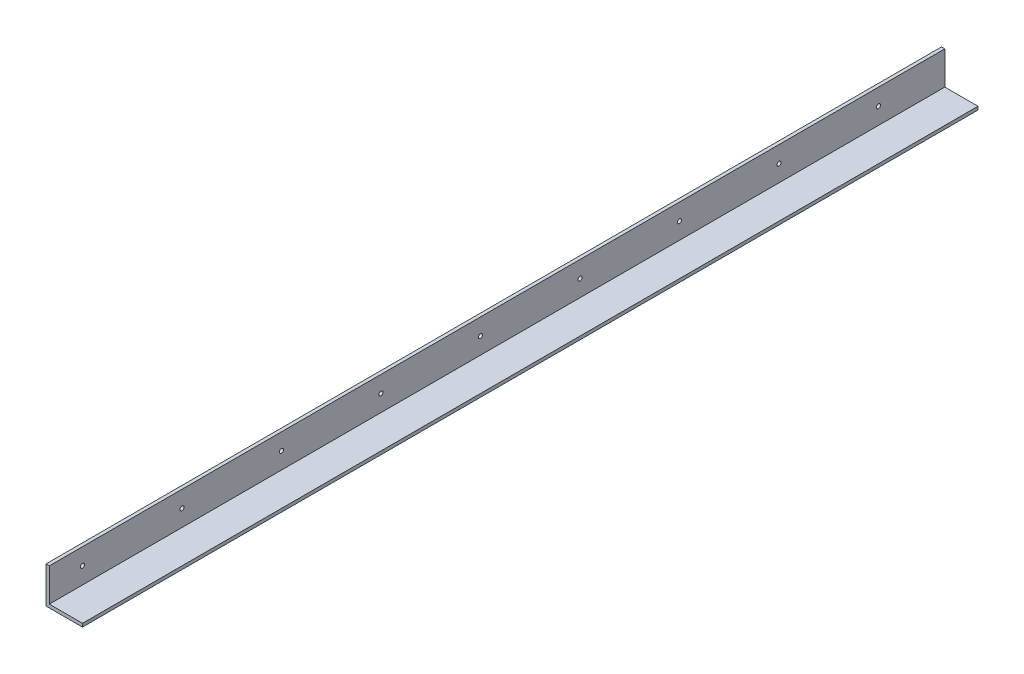
ISO-10303-21;
HEADER;
FILE_DESCRIPTION(('STEP AP214'),'2;1');
FILE_NAME('part.step','',(''),(''),'','','');
FILE_SCHEMA(('AUTOMOTIVE_DESIGN { 1 0 10303 214 1 1 1 1 }'));
ENDSEC;
DATA;
#1=APPLICATION_CONTEXT('core data for automotive mechanical design processes');
#2=APPLICATION_PROTOCOL_DEFINITION('international standard','automotive_design',2000,#1);
#3=PRODUCT_CONTEXT('',#1,'mechanical');
#4=PRODUCT('Part','Part','',(#3));
#5=PRODUCT_RELATED_PRODUCT_CATEGORY('part','',(#4));
#6=PRODUCT_DEFINITION_FORMATION('','',#4);
#7=PRODUCT_DEFINITION_CONTEXT('part definition',#1,'design');
#8=PRODUCT_DEFINITION('design','',#6,#7);
#9=PRODUCT_DEFINITION_SHAPE('','',#8);
#10=(LENGTH_UNIT() NAMED_UNIT(*) SI_UNIT(.MILLI.,.METRE.));
#11=(NAMED_UNIT(*) PLANE_ANGLE_UNIT() SI_UNIT($,.RADIAN.));
#12=(NAMED_UNIT(*) SI_UNIT($,.STERADIAN.) SOLID_ANGLE_UNIT());
#13=UNCERTAINTY_MEASURE_WITH_UNIT(LENGTH_MEASURE(1.E-05),#10,'distance_accuracy_value','');
#14=(GEOMETRIC_REPRESENTATION_CONTEXT(3) GLOBAL_UNCERTAINTY_ASSIGNED_CONTEXT((#13)) GLOBAL_UNIT_ASSIGNED_CONTEXT((#10,
#11,#12)) REPRESENTATION_CONTEXT('',''));
#15=CARTESIAN_POINT('',(0.,0.,0.));
#16=DIRECTION('',(0.,0.,1.));
#17=DIRECTION('',(1.,0.,0.));
#18=AXIS2_PLACEMENT_3D('',#15,#16,#17);
#19=CARTESIAN_POINT('',(0.,0.,1030.));
#20=DIRECTION('',(-1.,0.,0.));
#21=DIRECTION('',(0.,-1.,0.));
#22=AXIS2_PLACEMENT_3D('',#19,#20,#21);
#23=PLANE('',#22);
#24=CARTESIAN_POINT('',(0.,24.,990.));
#25=DIRECTION('',(1.,0.,0.));
#26=DIRECTION('',(0.,0.,-1.));
#27=AXIS2_PLACEMENT_3D('',#24,#25,#26);
#28=CIRCLE('',#27,2.49999999999991);
#29=CARTESIAN_POINT('',(0.,24.,987.5));
#30=VERTEX_POINT('',#29);
#31=EDGE_CURVE('E135',#30,#30,#28,.T.);
#32=ORIENTED_EDGE('',*,*,#31,.T.);
#33=EDGE_LOOP('',(#32));
#34=FACE_BOUND('',#33,.T.);
#35=CARTESIAN_POINT('',(0.,24.,870.));
#36=DIRECTION('',(1.,0.,0.));
#37=DIRECTION('',(0.,0.,-1.));
#38=AXIS2_PLACEMENT_3D('',#35,#36,#37);
#39=CIRCLE('',#38,2.49999999999991);
#40=CARTESIAN_POINT('',(0.,24.,867.5));
#41=VERTEX_POINT('',#40);
#42=EDGE_CURVE('E232',#41,#41,#39,.T.);
#43=ORIENTED_EDGE('',*,*,#42,.T.);
#44=EDGE_LOOP('',(#43));
#45=FACE_BOUND('',#44,.T.);
#46=CARTESIAN_POINT('',(0.,24.,750.));
#47=DIRECTION('',(1.,0.,0.));
#48=DIRECTION('',(0.,0.,-1.));
#49=AXIS2_PLACEMENT_3D('',#46,#47,#48);
#50=CIRCLE('',#49,2.49999999999991);
#51=CARTESIAN_POINT('',(0.,24.,747.5));
#52=VERTEX_POINT('',#51);
#53=EDGE_CURVE('E244',#52,#52,#50,.T.);
#54=ORIENTED_EDGE('',*,*,#53,.T.);
#55=EDGE_LOOP('',(#54));
#56=FACE_BOUND('',#55,.T.);
#57=CARTESIAN_POINT('',(0.,24.,630.));
#58=DIRECTION('',(1.,0.,0.));
#59=DIRECTION('',(0.,0.,-1.));
#60=AXIS2_PLACEMENT_3D('',#57,#58,#59);
#61=CIRCLE('',#60,2.49999999999991);
#62=CARTESIAN_POINT('',(0.,24.,627.5));
#63=VERTEX_POINT('',#62);
#64=EDGE_CURVE('E252',#63,#63,#61,.T.);
#65=ORIENTED_EDGE('',*,*,#64,.T.);
#66=EDGE_LOOP('',(#65));
#67=FACE_BOUND('',#66,.T.);
#68=CARTESIAN_POINT('',(0.,24.,510.));
#69=DIRECTION('',(1.,0.,0.));
#70=DIRECTION('',(0.,0.,-1.));
#71=AXIS2_PLACEMENT_3D('',#68,#69,#70);
#72=CIRCLE('',#71,2.49999999999991);
#73=CARTESIAN_POINT('',(0.,24.,507.5));
#74=VERTEX_POINT('',#73);
#75=EDGE_CURVE('E260',#74,#74,#72,.T.);
#76=ORIENTED_EDGE('',*,*,#75,.T.);
#77=EDGE_LOOP('',(#76));
#78=FACE_BOUND('',#77,.T.);
#79=CARTESIAN_POINT('',(0.,24.,390.));
#80=DIRECTION('',(1.,0.,0.));
#81=DIRECTION('',(0.,0.,-1.));
#82=AXIS2_PLACEMENT_3D('',#79,#80,#81);
#83=CIRCLE('',#82,2.49999999999991);
#84=CARTESIAN_POINT('',(0.,24.,387.5));
#85=VERTEX_POINT('',#84);
#86=EDGE_CURVE('E268',#85,#85,#83,.T.);
#87=ORIENTED_EDGE('',*,*,#86,.T.);
#88=EDGE_LOOP('',(#87));
#89=FACE_BOUND('',#88,.T.);
#90=CARTESIAN_POINT('',(0.,24.,270.));
#91=DIRECTION('',(1.,0.,0.));
#92=DIRECTION('',(0.,0.,-1.));
#93=AXIS2_PLACEMENT_3D('',#90,#91,#92);
#94=CIRCLE('',#93,2.49999999999991);
#95=CARTESIAN_POINT('',(0.,24.,267.5));
#96=VERTEX_POINT('',#95);
#97=EDGE_CURVE('E276',#96,#96,#94,.T.);
#98=ORIENTED_EDGE('',*,*,#97,.T.);
#99=EDGE_LOOP('',(#98));
#100=FACE_BOUND('',#99,.T.);
#101=CARTESIAN_POINT('',(0.,24.,150.));
#102=DIRECTION('',(1.,0.,0.));
#103=DIRECTION('',(0.,0.,-1.));
#104=AXIS2_PLACEMENT_3D('',#101,#102,#103);
#105=CIRCLE('',#104,2.49999999999991);
#106=CARTESIAN_POINT('',(0.,24.,147.5));
#107=VERTEX_POINT('',#106);
#108=EDGE_CURVE('E284',#107,#107,#105,.T.);
#109=ORIENTED_EDGE('',*,*,#108,.T.);
#110=EDGE_LOOP('',(#109));
#111=FACE_BOUND('',#110,.T.);
#112=CARTESIAN_POINT('',(0.,24.,30.));
#113=DIRECTION('',(1.,0.,0.));
#114=DIRECTION('',(0.,0.,-1.));
#115=AXIS2_PLACEMENT_3D('',#112,#113,#114);
#116=CIRCLE('',#115,2.49999999999991);
#117=CARTESIAN_POINT('',(0.,24.,27.5000000000001));
#118=VERTEX_POINT('',#117);
#119=EDGE_CURVE('E292',#118,#118,#116,.T.);
#120=ORIENTED_EDGE('',*,*,#119,.T.);
#121=EDGE_LOOP('',(#120));
#122=FACE_BOUND('',#121,.T.);
#123=DIRECTION('',(0.,1.,0.));
#124=VECTOR('',#123,1.);
#125=CARTESIAN_POINT('',(0.,0.,-50.));
#126=LINE('',#125,#124);
#127=CARTESIAN_POINT('',(0.,0.,-50.));
#128=VERTEX_POINT('',#127);
#129=CARTESIAN_POINT('',(0.,44.,-50.));
#130=VERTEX_POINT('',#129);
#131=EDGE_CURVE('E130',#128,#130,#126,.T.);
#132=ORIENTED_EDGE('',*,*,#131,.F.);
#133=DIRECTION('',(0.,0.,-1.));
#134=VECTOR('',#133,1.);
#135=CARTESIAN_POINT('',(0.,0.,1030.));
#136=LINE('',#135,#134);
#137=CARTESIAN_POINT('',(0.,0.,1030.));
#138=VERTEX_POINT('',#137);
#139=EDGE_CURVE('E11',#138,#128,#136,.T.);
#140=ORIENTED_EDGE('',*,*,#139,.F.);
#141=DIRECTION('',(0.,1.,0.));
#142=VECTOR('',#141,1.);
#143=CARTESIAN_POINT('',(0.,0.,1030.));
#144=LINE('',#143,#142);
#145=CARTESIAN_POINT('',(0.,44.,1030.));
#146=VERTEX_POINT('',#145);
#147=EDGE_CURVE('E151',#138,#146,#144,.T.);
#148=ORIENTED_EDGE('',*,*,#147,.T.);
#149=DIRECTION('',(0.,0.,-1.));
#150=VECTOR('',#149,1.);
#151=CARTESIAN_POINT('',(0.,44.,1030.));
#152=LINE('',#151,#150);
#153=EDGE_CURVE('E42',#146,#130,#152,.T.);
#154=ORIENTED_EDGE('',*,*,#153,.T.);
#155=EDGE_LOOP('',(#132,#140,#148,#154));
#156=FACE_BOUND('',#155,.T.);
#157=ADVANCED_FACE('F39',(#34,#45,#56,#67,#78,#89,#100,#111,#122,#156),#23,.T.);
#158=CARTESIAN_POINT('',(44.,0.,1030.));
#159=DIRECTION('',(0.,-1.,0.));
#160=DIRECTION('',(1.,0.,0.));
#161=AXIS2_PLACEMENT_3D('',#158,#159,#160);
#162=PLANE('',#161);
#163=DIRECTION('',(-1.,0.,0.));
#164=VECTOR('',#163,1.);
#165=CARTESIAN_POINT('',(44.,0.,-50.));
#166=LINE('',#165,#164);
#167=CARTESIAN_POINT('',(44.,0.,-50.));
#168=VERTEX_POINT('',#167);
#169=EDGE_CURVE('E148',#168,#128,#166,.T.);
#170=ORIENTED_EDGE('',*,*,#169,.F.);
#171=DIRECTION('',(0.,0.,-1.));
#172=VECTOR('',#171,1.);
#173=CARTESIAN_POINT('',(44.,0.,1030.));
#174=LINE('',#173,#172);
#175=CARTESIAN_POINT('',(44.,0.,1030.));
#176=VERTEX_POINT('',#175);
#177=EDGE_CURVE('E49',#176,#168,#174,.T.);
#178=ORIENTED_EDGE('',*,*,#177,.F.);
#179=DIRECTION('',(-1.,0.,0.));
#180=VECTOR('',#179,1.);
#181=CARTESIAN_POINT('',(44.,0.,1030.));
#182=LINE('',#181,#180);
#183=EDGE_CURVE('E116',#176,#138,#182,.T.);
#184=ORIENTED_EDGE('',*,*,#183,.T.);
#185=ORIENTED_EDGE('',*,*,#139,.T.);
#186=EDGE_LOOP('',(#170,#178,#184,#185));
#187=FACE_BOUND('',#186,.T.);
#188=ADVANCED_FACE('F163',(#187),#162,.T.);
#189=CARTESIAN_POINT('',(44.,3.99999999999999,1030.));
#190=DIRECTION('',(1.,0.,0.));
#191=DIRECTION('',(0.,0.,-1.));
#192=AXIS2_PLACEMENT_3D('',#189,#190,#191);
#193=PLANE('',#192);
#194=DIRECTION('',(0.,-1.,0.));
#195=VECTOR('',#194,1.);
#196=CARTESIAN_POINT('',(44.,3.99999999999999,-50.));
#197=LINE('',#196,#195);
#198=CARTESIAN_POINT('',(44.,3.99999999999999,-50.));
#199=VERTEX_POINT('',#198);
#200=EDGE_CURVE('E102',#199,#168,#197,.T.);
#201=ORIENTED_EDGE('',*,*,#200,.F.);
#202=DIRECTION('',(0.,0.,-1.));
#203=VECTOR('',#202,1.);
#204=CARTESIAN_POINT('',(44.,3.99999999999999,1030.));
#205=LINE('',#204,#203);
#206=CARTESIAN_POINT('',(44.,3.99999999999999,1030.));
#207=VERTEX_POINT('',#206);
#208=EDGE_CURVE('E97',#207,#199,#205,.T.);
#209=ORIENTED_EDGE('',*,*,#208,.F.);
#210=DIRECTION('',(0.,-1.,0.));
#211=VECTOR('',#210,1.);
#212=CARTESIAN_POINT('',(44.,3.99999999999999,1030.));
#213=LINE('',#212,#211);
#214=EDGE_CURVE('E100',#207,#176,#213,.T.);
#215=ORIENTED_EDGE('',*,*,#214,.T.);
#216=ORIENTED_EDGE('',*,*,#177,.T.);
#217=EDGE_LOOP('',(#201,#209,#215,#216));
#218=FACE_BOUND('',#217,.T.);
#219=ADVANCED_FACE('F99',(#218),#193,.T.);
#220=CARTESIAN_POINT('',(4.,4.,1030.));
#221=DIRECTION('',(0.,1.,0.));
#222=DIRECTION('',(-1.,0.,0.));
#223=AXIS2_PLACEMENT_3D('',#220,#221,#222);
#224=PLANE('',#223);
#225=DIRECTION('',(1.,0.,0.));
#226=VECTOR('',#225,1.);
#227=CARTESIAN_POINT('',(4.,4.,-50.));
#228=LINE('',#227,#226);
#229=CARTESIAN_POINT('',(4.,4.,-50.));
#230=VERTEX_POINT('',#229);
#231=EDGE_CURVE('E143',#230,#199,#228,.T.);
#232=ORIENTED_EDGE('',*,*,#231,.F.);
#233=DIRECTION('',(0.,0.,-1.));
#234=VECTOR('',#233,1.);
#235=CARTESIAN_POINT('',(4.,4.,1030.));
#236=LINE('',#235,#234);
#237=CARTESIAN_POINT('',(4.,4.,1030.));
#238=VERTEX_POINT('',#237);
#239=EDGE_CURVE('E108',#238,#230,#236,.T.);
#240=ORIENTED_EDGE('',*,*,#239,.F.);
#241=DIRECTION('',(1.,0.,0.));
#242=VECTOR('',#241,1.);
#243=CARTESIAN_POINT('',(4.,4.,1030.));
#244=LINE('',#243,#242);
#245=EDGE_CURVE('E114',#238,#207,#244,.T.);
#246=ORIENTED_EDGE('',*,*,#245,.T.);
#247=ORIENTED_EDGE('',*,*,#208,.T.);
#248=EDGE_LOOP('',(#232,#240,#246,#247));
#249=FACE_BOUND('',#248,.T.);
#250=ADVANCED_FACE('F119',(#249),#224,.T.);
#251=CARTESIAN_POINT('',(4.00000000000001,44.,1030.));
#252=DIRECTION('',(1.,0.,0.));
#253=DIRECTION('',(0.,1.,0.));
#254=AXIS2_PLACEMENT_3D('',#251,#252,#253);
#255=PLANE('',#254);
#256=CARTESIAN_POINT('',(4.,24.,990.));
#257=DIRECTION('',(1.,0.,0.));
#258=DIRECTION('',(0.,0.,-1.));
#259=AXIS2_PLACEMENT_3D('',#256,#257,#258);
#260=CIRCLE('',#259,2.49999999999991);
#261=CARTESIAN_POINT('',(4.,24.,987.5));
#262=VERTEX_POINT('',#261);
#263=EDGE_CURVE('E230',#262,#262,#260,.T.);
#264=ORIENTED_EDGE('',*,*,#263,.F.);
#265=EDGE_LOOP('',(#264));
#266=FACE_BOUND('',#265,.T.);
#267=CARTESIAN_POINT('',(4.,24.,870.));
#268=DIRECTION('',(1.,0.,0.));
#269=DIRECTION('',(0.,0.,-1.));
#270=AXIS2_PLACEMENT_3D('',#267,#268,#269);
#271=CIRCLE('',#270,2.49999999999991);
#272=CARTESIAN_POINT('',(4.,24.,867.5));
#273=VERTEX_POINT('',#272);
#274=EDGE_CURVE('E238',#273,#273,#271,.T.);
#275=ORIENTED_EDGE('',*,*,#274,.F.);
#276=EDGE_LOOP('',(#275));
#277=FACE_BOUND('',#276,.T.);
#278=CARTESIAN_POINT('',(4.,24.,750.));
#279=DIRECTION('',(1.,0.,0.));
#280=DIRECTION('',(0.,0.,-1.));
#281=AXIS2_PLACEMENT_3D('',#278,#279,#280);
#282=CIRCLE('',#281,2.49999999999991);
#283=CARTESIAN_POINT('',(4.,24.,747.5));
#284=VERTEX_POINT('',#283);
#285=EDGE_CURVE('E248',#284,#284,#282,.T.);
#286=ORIENTED_EDGE('',*,*,#285,.F.);
#287=EDGE_LOOP('',(#286));
#288=FACE_BOUND('',#287,.T.);
#289=CARTESIAN_POINT('',(4.,24.,630.));
#290=DIRECTION('',(1.,0.,0.));
#291=DIRECTION('',(0.,0.,-1.));
#292=AXIS2_PLACEMENT_3D('',#289,#290,#291);
#293=CIRCLE('',#292,2.49999999999991);
#294=CARTESIAN_POINT('',(4.,24.,627.5));
#295=VERTEX_POINT('',#294);
#296=EDGE_CURVE('E256',#295,#295,#293,.T.);
#297=ORIENTED_EDGE('',*,*,#296,.F.);
#298=EDGE_LOOP('',(#297));
#299=FACE_BOUND('',#298,.T.);
#300=CARTESIAN_POINT('',(4.,24.,510.));
#301=DIRECTION('',(1.,0.,0.));
#302=DIRECTION('',(0.,0.,-1.));
#303=AXIS2_PLACEMENT_3D('',#300,#301,#302);
#304=CIRCLE('',#303,2.49999999999991);
#305=CARTESIAN_POINT('',(4.,24.,507.5));
#306=VERTEX_POINT('',#305);
#307=EDGE_CURVE('E264',#306,#306,#304,.T.);
#308=ORIENTED_EDGE('',*,*,#307,.F.);
#309=EDGE_LOOP('',(#308));
#310=FACE_BOUND('',#309,.T.);
#311=CARTESIAN_POINT('',(4.,24.,390.));
#312=DIRECTION('',(1.,0.,0.));
#313=DIRECTION('',(0.,0.,-1.));
#314=AXIS2_PLACEMENT_3D('',#311,#312,#313);
#315=CIRCLE('',#314,2.49999999999991);
#316=CARTESIAN_POINT('',(4.,24.,387.5));
#317=VERTEX_POINT('',#316);
#318=EDGE_CURVE('E272',#317,#317,#315,.T.);
#319=ORIENTED_EDGE('',*,*,#318,.F.);
#320=EDGE_LOOP('',(#319));
#321=FACE_BOUND('',#320,.T.);
#322=CARTESIAN_POINT('',(4.,24.,270.));
#323=DIRECTION('',(1.,0.,0.));
#324=DIRECTION('',(0.,0.,-1.));
#325=AXIS2_PLACEMENT_3D('',#322,#323,#324);
#326=CIRCLE('',#325,2.49999999999991);
#327=CARTESIAN_POINT('',(4.,24.,267.5));
#328=VERTEX_POINT('',#327);
#329=EDGE_CURVE('E280',#328,#328,#326,.T.);
#330=ORIENTED_EDGE('',*,*,#329,.F.);
#331=EDGE_LOOP('',(#330));
#332=FACE_BOUND('',#331,.T.);
#333=CARTESIAN_POINT('',(4.,24.,150.));
#334=DIRECTION('',(1.,0.,0.));
#335=DIRECTION('',(0.,0.,-1.));
#336=AXIS2_PLACEMENT_3D('',#333,#334,#335);
#337=CIRCLE('',#336,2.49999999999991);
#338=CARTESIAN_POINT('',(4.,24.,147.5));
#339=VERTEX_POINT('',#338);
#340=EDGE_CURVE('E288',#339,#339,#337,.T.);
#341=ORIENTED_EDGE('',*,*,#340,.F.);
#342=EDGE_LOOP('',(#341));
#343=FACE_BOUND('',#342,.T.);
#344=CARTESIAN_POINT('',(4.,24.,30.));
#345=DIRECTION('',(1.,0.,0.));
#346=DIRECTION('',(0.,0.,-1.));
#347=AXIS2_PLACEMENT_3D('',#344,#345,#346);
#348=CIRCLE('',#347,2.49999999999991);
#349=CARTESIAN_POINT('',(4.,24.,27.5000000000001));
#350=VERTEX_POINT('',#349);
#351=EDGE_CURVE('E296',#350,#350,#348,.T.);
#352=ORIENTED_EDGE('',*,*,#351,.F.);
#353=EDGE_LOOP('',(#352));
#354=FACE_BOUND('',#353,.T.);
#355=DIRECTION('',(0.,-1.,0.));
#356=VECTOR('',#355,1.);
#357=CARTESIAN_POINT('',(4.00000000000001,44.,-50.));
#358=LINE('',#357,#356);
#359=CARTESIAN_POINT('',(4.00000000000001,44.,-50.));
#360=VERTEX_POINT('',#359);
#361=EDGE_CURVE('E139',#360,#230,#358,.T.);
#362=ORIENTED_EDGE('',*,*,#361,.F.);
#363=DIRECTION('',(0.,0.,-1.));
#364=VECTOR('',#363,1.);
#365=CARTESIAN_POINT('',(4.00000000000001,44.,1030.));
#366=LINE('',#365,#364);
#367=CARTESIAN_POINT('',(4.00000000000001,44.,1030.));
#368=VERTEX_POINT('',#367);
#369=EDGE_CURVE('E156',#368,#360,#366,.T.);
#370=ORIENTED_EDGE('',*,*,#369,.F.);
#371=DIRECTION('',(0.,-1.,0.));
#372=VECTOR('',#371,1.);
#373=CARTESIAN_POINT('',(4.00000000000001,44.,1030.));
#374=LINE('',#373,#372);
#375=EDGE_CURVE('E121',#368,#238,#374,.T.);
#376=ORIENTED_EDGE('',*,*,#375,.T.);
#377=ORIENTED_EDGE('',*,*,#239,.T.);
#378=EDGE_LOOP('',(#362,#370,#376,#377));
#379=FACE_BOUND('',#378,.T.);
#380=ADVANCED_FACE('F177',(#266,#277,#288,#299,#310,#321,#332,#343,#354,#379),#255,.T.);
#381=CARTESIAN_POINT('',(0.,44.,1030.));
#382=DIRECTION('',(0.,1.,0.));
#383=DIRECTION('',(0.,0.,1.));
#384=AXIS2_PLACEMENT_3D('',#381,#382,#383);
#385=PLANE('',#384);
#386=DIRECTION('',(1.,0.,0.));
#387=VECTOR('',#386,1.);
#388=CARTESIAN_POINT('',(0.,44.,-50.));
#389=LINE('',#388,#387);
#390=EDGE_CURVE('E134',#130,#360,#389,.T.);
#391=ORIENTED_EDGE('',*,*,#390,.F.);
#392=ORIENTED_EDGE('',*,*,#153,.F.);
#393=DIRECTION('',(1.,0.,0.));
#394=VECTOR('',#393,1.);
#395=CARTESIAN_POINT('',(0.,44.,1030.));
#396=LINE('',#395,#394);
#397=EDGE_CURVE('E124',#146,#368,#396,.T.);
#398=ORIENTED_EDGE('',*,*,#397,.T.);
#399=ORIENTED_EDGE('',*,*,#369,.T.);
#400=EDGE_LOOP('',(#391,#392,#398,#399));
#401=FACE_BOUND('',#400,.T.);
#402=ADVANCED_FACE('F160',(#401),#385,.T.);
#403=CARTESIAN_POINT('',(0.,0.,1030.));
#404=DIRECTION('',(0.,0.,-1.));
#405=DIRECTION('',(-1.,0.,0.));
#406=AXIS2_PLACEMENT_3D('',#403,#404,#405);
#407=PLANE('',#406);
#408=ORIENTED_EDGE('',*,*,#147,.F.);
#409=ORIENTED_EDGE('',*,*,#183,.F.);
#410=ORIENTED_EDGE('',*,*,#214,.F.);
#411=ORIENTED_EDGE('',*,*,#245,.F.);
#412=ORIENTED_EDGE('',*,*,#375,.F.);
#413=ORIENTED_EDGE('',*,*,#397,.F.);
#414=EDGE_LOOP('',(#408,#409,#410,#411,#412,#413));
#415=FACE_BOUND('',#414,.T.);
#416=ADVANCED_FACE('F112',(#415),#407,.F.);
#417=CARTESIAN_POINT('',(0.,0.,-50.));
#418=DIRECTION('',(0.,0.,-1.));
#419=DIRECTION('',(-1.,0.,0.));
#420=AXIS2_PLACEMENT_3D('',#417,#418,#419);
#421=PLANE('',#420);
#422=ORIENTED_EDGE('',*,*,#131,.T.);
#423=ORIENTED_EDGE('',*,*,#390,.T.);
#424=ORIENTED_EDGE('',*,*,#361,.T.);
#425=ORIENTED_EDGE('',*,*,#231,.T.);
#426=ORIENTED_EDGE('',*,*,#200,.T.);
#427=ORIENTED_EDGE('',*,*,#169,.T.);
#428=EDGE_LOOP('',(#422,#423,#424,#425,#426,#427));
#429=FACE_BOUND('',#428,.T.);
#430=ADVANCED_FACE('F162',(#429),#421,.T.);
#431=CARTESIAN_POINT('',(0.,24.,30.));
#432=DIRECTION('',(1.,0.,0.));
#433=DIRECTION('',(0.,0.,-1.));
#434=AXIS2_PLACEMENT_3D('',#431,#432,#433);
#435=CYLINDRICAL_SURFACE('',#434,2.49999999999991);
#436=ORIENTED_EDGE('',*,*,#119,.F.);
#437=EDGE_LOOP('',(#436));
#438=FACE_BOUND('',#437,.T.);
#439=ORIENTED_EDGE('',*,*,#351,.T.);
#440=EDGE_LOOP('',(#439));
#441=FACE_BOUND('',#440,.T.);
#442=ADVANCED_FACE('F187',(#438,#441),#435,.F.);
#443=CARTESIAN_POINT('',(0.,24.,150.));
#444=DIRECTION('',(1.,0.,0.));
#445=DIRECTION('',(0.,0.,-1.));
#446=AXIS2_PLACEMENT_3D('',#443,#444,#445);
#447=CYLINDRICAL_SURFACE('',#446,2.49999999999991);
#448=ORIENTED_EDGE('',*,*,#108,.F.);
#449=EDGE_LOOP('',(#448));
#450=FACE_BOUND('',#449,.T.);
#451=ORIENTED_EDGE('',*,*,#340,.T.);
#452=EDGE_LOOP('',(#451));
#453=FACE_BOUND('',#452,.T.);
#454=ADVANCED_FACE('F191',(#450,#453),#447,.F.);
#455=CARTESIAN_POINT('',(0.,24.,270.));
#456=DIRECTION('',(1.,0.,0.));
#457=DIRECTION('',(0.,0.,-1.));
#458=AXIS2_PLACEMENT_3D('',#455,#456,#457);
#459=CYLINDRICAL_SURFACE('',#458,2.49999999999991);
#460=ORIENTED_EDGE('',*,*,#97,.F.);
#461=EDGE_LOOP('',(#460));
#462=FACE_BOUND('',#461,.T.);
#463=ORIENTED_EDGE('',*,*,#329,.T.);
#464=EDGE_LOOP('',(#463));
#465=FACE_BOUND('',#464,.T.);
#466=ADVANCED_FACE('F195',(#462,#465),#459,.F.);
#467=CARTESIAN_POINT('',(0.,24.,390.));
#468=DIRECTION('',(1.,0.,0.));
#469=DIRECTION('',(0.,0.,-1.));
#470=AXIS2_PLACEMENT_3D('',#467,#468,#469);
#471=CYLINDRICAL_SURFACE('',#470,2.49999999999991);
#472=ORIENTED_EDGE('',*,*,#86,.F.);
#473=EDGE_LOOP('',(#472));
#474=FACE_BOUND('',#473,.T.);
#475=ORIENTED_EDGE('',*,*,#318,.T.);
#476=EDGE_LOOP('',(#475));
#477=FACE_BOUND('',#476,.T.);
#478=ADVANCED_FACE('F199',(#474,#477),#471,.F.);
#479=CARTESIAN_POINT('',(0.,24.,510.));
#480=DIRECTION('',(1.,0.,0.));
#481=DIRECTION('',(0.,0.,-1.));
#482=AXIS2_PLACEMENT_3D('',#479,#480,#481);
#483=CYLINDRICAL_SURFACE('',#482,2.49999999999991);
#484=ORIENTED_EDGE('',*,*,#75,.F.);
#485=EDGE_LOOP('',(#484));
#486=FACE_BOUND('',#485,.T.);
#487=ORIENTED_EDGE('',*,*,#307,.T.);
#488=EDGE_LOOP('',(#487));
#489=FACE_BOUND('',#488,.T.);
#490=ADVANCED_FACE('F203',(#486,#489),#483,.F.);
#491=CARTESIAN_POINT('',(0.,24.,630.));
#492=DIRECTION('',(1.,0.,0.));
#493=DIRECTION('',(0.,0.,-1.));
#494=AXIS2_PLACEMENT_3D('',#491,#492,#493);
#495=CYLINDRICAL_SURFACE('',#494,2.49999999999991);
#496=ORIENTED_EDGE('',*,*,#64,.F.);
#497=EDGE_LOOP('',(#496));
#498=FACE_BOUND('',#497,.T.);
#499=ORIENTED_EDGE('',*,*,#296,.T.);
#500=EDGE_LOOP('',(#499));
#501=FACE_BOUND('',#500,.T.);
#502=ADVANCED_FACE('F207',(#498,#501),#495,.F.);
#503=CARTESIAN_POINT('',(0.,24.,750.));
#504=DIRECTION('',(1.,0.,0.));
#505=DIRECTION('',(0.,0.,-1.));
#506=AXIS2_PLACEMENT_3D('',#503,#504,#505);
#507=CYLINDRICAL_SURFACE('',#506,2.49999999999991);
#508=ORIENTED_EDGE('',*,*,#53,.F.);
#509=EDGE_LOOP('',(#508));
#510=FACE_BOUND('',#509,.T.);
#511=ORIENTED_EDGE('',*,*,#285,.T.);
#512=EDGE_LOOP('',(#511));
#513=FACE_BOUND('',#512,.T.);
#514=ADVANCED_FACE('F211',(#510,#513),#507,.F.);
#515=CARTESIAN_POINT('',(0.,24.,870.));
#516=DIRECTION('',(1.,0.,0.));
#517=DIRECTION('',(0.,0.,-1.));
#518=AXIS2_PLACEMENT_3D('',#515,#516,#517);
#519=CYLINDRICAL_SURFACE('',#518,2.49999999999991);
#520=ORIENTED_EDGE('',*,*,#42,.F.);
#521=EDGE_LOOP('',(#520));
#522=FACE_BOUND('',#521,.T.);
#523=ORIENTED_EDGE('',*,*,#274,.T.);
#524=EDGE_LOOP('',(#523));
#525=FACE_BOUND('',#524,.T.);
#526=ADVANCED_FACE('F215',(#522,#525),#519,.F.);
#527=CARTESIAN_POINT('',(0.,24.,990.));
#528=DIRECTION('',(1.,0.,0.));
#529=DIRECTION('',(0.,0.,-1.));
#530=AXIS2_PLACEMENT_3D('',#527,#528,#529);
#531=CYLINDRICAL_SURFACE('',#530,2.49999999999991);
#532=ORIENTED_EDGE('',*,*,#31,.F.);
#533=EDGE_LOOP('',(#532));
#534=FACE_BOUND('',#533,.T.);
#535=ORIENTED_EDGE('',*,*,#263,.T.);
#536=EDGE_LOOP('',(#535));
#537=FACE_BOUND('',#536,.T.);
#538=ADVANCED_FACE('F219',(#534,#537),#531,.F.);
#539=CLOSED_SHELL('',(#157,#188,#219,#250,#380,#402,#416,#430,#442,#454,#466,#478,#490,#502,
#514,#526,#538));
#540=MANIFOLD_SOLID_BREP('B2',#539);
#541=ADVANCED_BREP_SHAPE_REPRESENTATION('',(#18,#540),#14);
#542=SHAPE_DEFINITION_REPRESENTATION(#9,#541);
ENDSEC;
END-ISO-10303-21;
